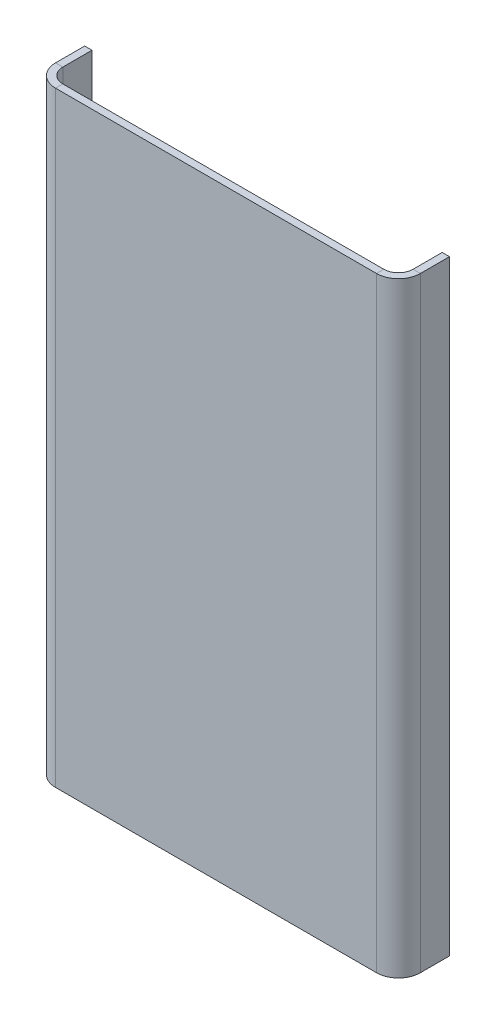
ISO-10303-21;
HEADER;
FILE_DESCRIPTION(('STEP AP214'),'2;1');
FILE_NAME('part.step','',(''),(''),'','','');
FILE_SCHEMA(('AUTOMOTIVE_DESIGN { 1 0 10303 214 1 1 1 1 }'));
ENDSEC;
DATA;
#1=APPLICATION_CONTEXT('core data for automotive mechanical design processes');
#2=APPLICATION_PROTOCOL_DEFINITION('international standard','automotive_design',2000,#1);
#3=PRODUCT_CONTEXT('',#1,'mechanical');
#4=PRODUCT('Part','Part','',(#3));
#5=PRODUCT_RELATED_PRODUCT_CATEGORY('part','',(#4));
#6=PRODUCT_DEFINITION_FORMATION('','',#4);
#7=PRODUCT_DEFINITION_CONTEXT('part definition',#1,'design');
#8=PRODUCT_DEFINITION('design','',#6,#7);
#9=PRODUCT_DEFINITION_SHAPE('','',#8);
#10=(LENGTH_UNIT() NAMED_UNIT(*) SI_UNIT(.MILLI.,.METRE.));
#11=(NAMED_UNIT(*) PLANE_ANGLE_UNIT() SI_UNIT($,.RADIAN.));
#12=(NAMED_UNIT(*) SI_UNIT($,.STERADIAN.) SOLID_ANGLE_UNIT());
#13=UNCERTAINTY_MEASURE_WITH_UNIT(LENGTH_MEASURE(1.E-05),#10,'distance_accuracy_value','');
#14=(GEOMETRIC_REPRESENTATION_CONTEXT(3) GLOBAL_UNCERTAINTY_ASSIGNED_CONTEXT((#13)) GLOBAL_UNIT_ASSIGNED_CONTEXT((#10,
#11,#12)) REPRESENTATION_CONTEXT('',''));
#15=CARTESIAN_POINT('',(0.,0.,0.));
#16=DIRECTION('',(0.,0.,1.));
#17=DIRECTION('',(1.,0.,0.));
#18=AXIS2_PLACEMENT_3D('',#15,#16,#17);
#19=CARTESIAN_POINT('',(0.,0.,-10.));
#20=DIRECTION('',(0.,0.,-1.));
#21=DIRECTION('',(-1.,0.,0.));
#22=AXIS2_PLACEMENT_3D('',#19,#20,#21);
#23=PLANE('',#22);
#24=DIRECTION('',(-1.,0.,0.));
#25=VECTOR('',#24,1.);
#26=CARTESIAN_POINT('',(-250.,415.,-10.));
#27=LINE('',#26,#25);
#28=CARTESIAN_POINT('',(220.,415.,-10.0000000000001));
#29=VERTEX_POINT('',#28);
#30=CARTESIAN_POINT('',(-220.,415.,-10.));
#31=VERTEX_POINT('',#30);
#32=EDGE_CURVE('E93',#29,#31,#27,.T.);
#33=ORIENTED_EDGE('',*,*,#32,.F.);
#34=DIRECTION('',(0.,-1.,0.));
#35=VECTOR('',#34,1.);
#36=CARTESIAN_POINT('',(220.,-415.,-10.0000000000001));
#37=LINE('',#36,#35);
#38=CARTESIAN_POINT('',(220.,-415.,-10.0000000000001));
#39=VERTEX_POINT('',#38);
#40=EDGE_CURVE('E229',#39,#29,#37,.F.);
#41=ORIENTED_EDGE('',*,*,#40,.F.);
#42=DIRECTION('',(1.,0.,0.));
#43=VECTOR('',#42,1.);
#44=CARTESIAN_POINT('',(-250.,-415.,-10.));
#45=LINE('',#44,#43);
#46=CARTESIAN_POINT('',(-220.,-415.,-10.));
#47=VERTEX_POINT('',#46);
#48=EDGE_CURVE('E13',#47,#39,#45,.T.);
#49=ORIENTED_EDGE('',*,*,#48,.F.);
#50=DIRECTION('',(0.,1.,0.));
#51=VECTOR('',#50,1.);
#52=CARTESIAN_POINT('',(-220.,415.,-10.0000000000001));
#53=LINE('',#52,#51);
#54=EDGE_CURVE('E283',#31,#47,#53,.F.);
#55=ORIENTED_EDGE('',*,*,#54,.F.);
#56=EDGE_LOOP('',(#33,#41,#49,#55));
#57=FACE_BOUND('',#56,.T.);
#58=ADVANCED_FACE('F84',(#57),#23,.T.);
#59=CARTESIAN_POINT('',(0.,0.,0.));
#60=DIRECTION('',(0.,0.,-1.));
#61=DIRECTION('',(-1.,0.,0.));
#62=AXIS2_PLACEMENT_3D('',#59,#60,#61);
#63=PLANE('',#62);
#64=DIRECTION('',(0.,-1.,0.));
#65=VECTOR('',#64,1.);
#66=CARTESIAN_POINT('',(220.,-415.,0.));
#67=LINE('',#66,#65);
#68=CARTESIAN_POINT('',(220.,-415.,0.));
#69=VERTEX_POINT('',#68);
#70=CARTESIAN_POINT('',(220.,415.,0.));
#71=VERTEX_POINT('',#70);
#72=EDGE_CURVE('E217',#69,#71,#67,.F.);
#73=ORIENTED_EDGE('',*,*,#72,.T.);
#74=DIRECTION('',(-1.,0.,0.));
#75=VECTOR('',#74,1.);
#76=CARTESIAN_POINT('',(-250.,415.,0.));
#77=LINE('',#76,#75);
#78=CARTESIAN_POINT('',(-220.,415.,0.));
#79=VERTEX_POINT('',#78);
#80=EDGE_CURVE('E289',#71,#79,#77,.T.);
#81=ORIENTED_EDGE('',*,*,#80,.T.);
#82=DIRECTION('',(0.,1.,0.));
#83=VECTOR('',#82,1.);
#84=CARTESIAN_POINT('',(-220.,415.,0.));
#85=LINE('',#84,#83);
#86=CARTESIAN_POINT('',(-220.,-415.,0.));
#87=VERTEX_POINT('',#86);
#88=EDGE_CURVE('E271',#79,#87,#85,.F.);
#89=ORIENTED_EDGE('',*,*,#88,.T.);
#90=DIRECTION('',(1.,0.,0.));
#91=VECTOR('',#90,1.);
#92=CARTESIAN_POINT('',(-250.,-415.,0.));
#93=LINE('',#92,#91);
#94=EDGE_CURVE('E88',#87,#69,#93,.T.);
#95=ORIENTED_EDGE('',*,*,#94,.T.);
#96=EDGE_LOOP('',(#73,#81,#89,#95));
#97=FACE_BOUND('',#96,.T.);
#98=ADVANCED_FACE('F295',(#97),#63,.F.);
#99=CARTESIAN_POINT('',(-250.,-415.,-10.));
#100=DIRECTION('',(0.,-1.,0.));
#101=DIRECTION('',(0.,0.,-1.));
#102=AXIS2_PLACEMENT_3D('',#99,#100,#101);
#103=PLANE('',#102);
#104=ORIENTED_EDGE('',*,*,#48,.T.);
#105=DIRECTION('',(0.,0.,1.));
#106=VECTOR('',#105,1.);
#107=CARTESIAN_POINT('',(220.,-415.,-10.0000000000001));
#108=LINE('',#107,#106);
#109=EDGE_CURVE('E223',#39,#69,#108,.T.);
#110=ORIENTED_EDGE('',*,*,#109,.T.);
#111=ORIENTED_EDGE('',*,*,#94,.F.);
#112=DIRECTION('',(0.,0.,1.));
#113=VECTOR('',#112,1.);
#114=CARTESIAN_POINT('',(-220.,-415.,-10.0000000000001));
#115=LINE('',#114,#113);
#116=EDGE_CURVE('E107',#47,#87,#115,.T.);
#117=ORIENTED_EDGE('',*,*,#116,.F.);
#118=EDGE_LOOP('',(#104,#110,#111,#117));
#119=FACE_BOUND('',#118,.T.);
#120=ADVANCED_FACE('F298',(#119),#103,.T.);
#121=CARTESIAN_POINT('',(-250.,415.,-10.));
#122=DIRECTION('',(0.,1.,0.));
#123=DIRECTION('',(0.,0.,1.));
#124=AXIS2_PLACEMENT_3D('',#121,#122,#123);
#125=PLANE('',#124);
#126=DIRECTION('',(0.,0.,1.));
#127=VECTOR('',#126,1.);
#128=CARTESIAN_POINT('',(220.,415.,-10.0000000000001));
#129=LINE('',#128,#127);
#130=EDGE_CURVE('E235',#29,#71,#129,.T.);
#131=ORIENTED_EDGE('',*,*,#130,.F.);
#132=ORIENTED_EDGE('',*,*,#32,.T.);
#133=DIRECTION('',(0.,0.,1.));
#134=VECTOR('',#133,1.);
#135=CARTESIAN_POINT('',(-220.,415.,-10.0000000000001));
#136=LINE('',#135,#134);
#137=EDGE_CURVE('E277',#31,#79,#136,.T.);
#138=ORIENTED_EDGE('',*,*,#137,.T.);
#139=ORIENTED_EDGE('',*,*,#80,.F.);
#140=EDGE_LOOP('',(#131,#132,#138,#139));
#141=FACE_BOUND('',#140,.T.);
#142=ADVANCED_FACE('F86',(#141),#125,.T.);
#143=CARTESIAN_POINT('',(-220.,-415.,-30.));
#144=DIRECTION('',(0.,-1.,0.));
#145=DIRECTION('',(0.,0.,-1.));
#146=AXIS2_PLACEMENT_3D('',#143,#144,#145);
#147=PLANE('',#146);
#148=DIRECTION('',(1.,0.,0.));
#149=VECTOR('',#148,1.);
#150=CARTESIAN_POINT('',(-250.,-415.,-29.9999999999999));
#151=LINE('',#150,#149);
#152=CARTESIAN_POINT('',(-240.,-415.,-30.));
#153=VERTEX_POINT('',#152);
#154=CARTESIAN_POINT('',(-250.,-415.,-29.9999999999999));
#155=VERTEX_POINT('',#154);
#156=EDGE_CURVE('E238',#153,#155,#151,.F.);
#157=ORIENTED_EDGE('',*,*,#156,.F.);
#158=CARTESIAN_POINT('',(-220.,-415.,-30.));
#159=DIRECTION('',(0.,1.,0.));
#160=DIRECTION('',(0.,0.,1.));
#161=AXIS2_PLACEMENT_3D('',#158,#159,#160);
#162=CIRCLE('',#161,20.);
#163=EDGE_CURVE('E280',#47,#153,#162,.F.);
#164=ORIENTED_EDGE('',*,*,#163,.F.);
#165=ORIENTED_EDGE('',*,*,#116,.T.);
#166=CARTESIAN_POINT('',(-220.,-415.,-30.));
#167=DIRECTION('',(0.,1.,0.));
#168=DIRECTION('',(0.,0.,1.));
#169=AXIS2_PLACEMENT_3D('',#166,#167,#168);
#170=CIRCLE('',#169,30.);
#171=EDGE_CURVE('E273',#87,#155,#170,.F.);
#172=ORIENTED_EDGE('',*,*,#171,.T.);
#173=EDGE_LOOP('',(#157,#164,#165,#172));
#174=FACE_BOUND('',#173,.T.);
#175=ADVANCED_FACE('F350',(#174),#147,.T.);
#176=CARTESIAN_POINT('',(-220.,415.,-30.));
#177=DIRECTION('',(0.,-1.,0.));
#178=DIRECTION('',(0.,0.,-1.));
#179=AXIS2_PLACEMENT_3D('',#176,#177,#178);
#180=PLANE('',#179);
#181=CARTESIAN_POINT('',(-220.,415.,-30.));
#182=DIRECTION('',(0.,1.,0.));
#183=DIRECTION('',(0.,0.,1.));
#184=AXIS2_PLACEMENT_3D('',#181,#182,#183);
#185=CIRCLE('',#184,20.);
#186=CARTESIAN_POINT('',(-240.,415.,-30.));
#187=VERTEX_POINT('',#186);
#188=EDGE_CURVE('E244',#187,#31,#185,.T.);
#189=ORIENTED_EDGE('',*,*,#188,.F.);
#190=DIRECTION('',(1.,0.,0.));
#191=VECTOR('',#190,1.);
#192=CARTESIAN_POINT('',(-240.,415.,-30.));
#193=LINE('',#192,#191);
#194=CARTESIAN_POINT('',(-250.,415.,-29.9999999999999));
#195=VERTEX_POINT('',#194);
#196=EDGE_CURVE('E264',#187,#195,#193,.F.);
#197=ORIENTED_EDGE('',*,*,#196,.T.);
#198=CARTESIAN_POINT('',(-220.,415.,-30.));
#199=DIRECTION('',(0.,1.,0.));
#200=DIRECTION('',(0.,0.,1.));
#201=AXIS2_PLACEMENT_3D('',#198,#199,#200);
#202=CIRCLE('',#201,30.);
#203=EDGE_CURVE('E274',#195,#79,#202,.T.);
#204=ORIENTED_EDGE('',*,*,#203,.T.);
#205=ORIENTED_EDGE('',*,*,#137,.F.);
#206=EDGE_LOOP('',(#189,#197,#204,#205));
#207=FACE_BOUND('',#206,.T.);
#208=ADVANCED_FACE('F323',(#207),#180,.F.);
#209=CARTESIAN_POINT('',(-220.,415.,-30.));
#210=DIRECTION('',(0.,1.,0.));
#211=DIRECTION('',(-1.,0.,0.));
#212=AXIS2_PLACEMENT_3D('',#209,#210,#211);
#213=CYLINDRICAL_SURFACE('',#212,30.);
#214=ORIENTED_EDGE('',*,*,#88,.F.);
#215=ORIENTED_EDGE('',*,*,#203,.F.);
#216=DIRECTION('',(0.,1.,0.));
#217=VECTOR('',#216,1.);
#218=CARTESIAN_POINT('',(-250.,-415.,-29.9999999999999));
#219=LINE('',#218,#217);
#220=EDGE_CURVE('E262',#195,#155,#219,.F.);
#221=ORIENTED_EDGE('',*,*,#220,.T.);
#222=ORIENTED_EDGE('',*,*,#171,.F.);
#223=EDGE_LOOP('',(#214,#215,#221,#222));
#224=FACE_BOUND('',#223,.T.);
#225=ADVANCED_FACE('F348',(#224),#213,.T.);
#226=CARTESIAN_POINT('',(-220.,415.,-30.));
#227=DIRECTION('',(0.,1.,0.));
#228=DIRECTION('',(-1.,0.,0.));
#229=AXIS2_PLACEMENT_3D('',#226,#227,#228);
#230=CYLINDRICAL_SURFACE('',#229,20.);
#231=ORIENTED_EDGE('',*,*,#54,.T.);
#232=ORIENTED_EDGE('',*,*,#163,.T.);
#233=DIRECTION('',(0.,1.,0.));
#234=VECTOR('',#233,1.);
#235=CARTESIAN_POINT('',(-240.,-415.,-30.));
#236=LINE('',#235,#234);
#237=EDGE_CURVE('E267',#153,#187,#236,.T.);
#238=ORIENTED_EDGE('',*,*,#237,.T.);
#239=ORIENTED_EDGE('',*,*,#188,.T.);
#240=EDGE_LOOP('',(#231,#232,#238,#239));
#241=FACE_BOUND('',#240,.T.);
#242=ADVANCED_FACE('F325',(#241),#230,.F.);
#243=CARTESIAN_POINT('',(-250.,415.,-70.));
#244=DIRECTION('',(0.,-1.,0.));
#245=DIRECTION('',(0.,0.,-1.));
#246=AXIS2_PLACEMENT_3D('',#243,#244,#245);
#247=PLANE('',#246);
#248=ORIENTED_EDGE('',*,*,#196,.F.);
#249=DIRECTION('',(0.,0.,1.));
#250=VECTOR('',#249,1.);
#251=CARTESIAN_POINT('',(-240.,415.,-70.));
#252=LINE('',#251,#250);
#253=CARTESIAN_POINT('',(-240.,415.,-70.));
#254=VERTEX_POINT('',#253);
#255=EDGE_CURVE('E260',#187,#254,#252,.F.);
#256=ORIENTED_EDGE('',*,*,#255,.T.);
#257=DIRECTION('',(1.,0.,0.));
#258=VECTOR('',#257,1.);
#259=CARTESIAN_POINT('',(-250.,415.,-70.));
#260=LINE('',#259,#258);
#261=CARTESIAN_POINT('',(-250.,415.,-70.));
#262=VERTEX_POINT('',#261);
#263=EDGE_CURVE('E241',#262,#254,#260,.T.);
#264=ORIENTED_EDGE('',*,*,#263,.F.);
#265=DIRECTION('',(0.,0.,-1.));
#266=VECTOR('',#265,1.);
#267=CARTESIAN_POINT('',(-250.,415.,9.60100667242728E-13));
#268=LINE('',#267,#266);
#269=EDGE_CURVE('E253',#195,#262,#268,.T.);
#270=ORIENTED_EDGE('',*,*,#269,.F.);
#271=EDGE_LOOP('',(#248,#256,#264,#270));
#272=FACE_BOUND('',#271,.T.);
#273=ADVANCED_FACE('F342',(#272),#247,.F.);
#274=CARTESIAN_POINT('',(-250.,-415.,-9.99999999999997));
#275=DIRECTION('',(0.,1.,0.));
#276=DIRECTION('',(0.,0.,1.));
#277=AXIS2_PLACEMENT_3D('',#274,#275,#276);
#278=PLANE('',#277);
#279=ORIENTED_EDGE('',*,*,#156,.T.);
#280=DIRECTION('',(0.,0.,1.));
#281=VECTOR('',#280,1.);
#282=CARTESIAN_POINT('',(-250.,-415.,9.60100667242728E-13));
#283=LINE('',#282,#281);
#284=CARTESIAN_POINT('',(-250.,-415.,-70.));
#285=VERTEX_POINT('',#284);
#286=EDGE_CURVE('E248',#285,#155,#283,.T.);
#287=ORIENTED_EDGE('',*,*,#286,.F.);
#288=DIRECTION('',(1.,0.,0.));
#289=VECTOR('',#288,1.);
#290=CARTESIAN_POINT('',(-250.,-415.,-70.));
#291=LINE('',#290,#289);
#292=CARTESIAN_POINT('',(-240.,-415.,-70.));
#293=VERTEX_POINT('',#292);
#294=EDGE_CURVE('E245',#285,#293,#291,.T.);
#295=ORIENTED_EDGE('',*,*,#294,.T.);
#296=DIRECTION('',(0.,0.,-1.));
#297=VECTOR('',#296,1.);
#298=CARTESIAN_POINT('',(-240.,-415.,-10.));
#299=LINE('',#298,#297);
#300=EDGE_CURVE('E255',#293,#153,#299,.F.);
#301=ORIENTED_EDGE('',*,*,#300,.T.);
#302=EDGE_LOOP('',(#279,#287,#295,#301));
#303=FACE_BOUND('',#302,.T.);
#304=ADVANCED_FACE('F333',(#303),#278,.F.);
#305=CARTESIAN_POINT('',(-250.,0.,9.60100667242728E-13));
#306=DIRECTION('',(1.,0.,0.));
#307=DIRECTION('',(0.,0.,-1.));
#308=AXIS2_PLACEMENT_3D('',#305,#306,#307);
#309=PLANE('',#308);
#310=ORIENTED_EDGE('',*,*,#220,.F.);
#311=ORIENTED_EDGE('',*,*,#269,.T.);
#312=DIRECTION('',(0.,-1.,0.));
#313=VECTOR('',#312,1.);
#314=CARTESIAN_POINT('',(-250.,0.,-70.));
#315=LINE('',#314,#313);
#316=EDGE_CURVE('E251',#262,#285,#315,.T.);
#317=ORIENTED_EDGE('',*,*,#316,.T.);
#318=ORIENTED_EDGE('',*,*,#286,.T.);
#319=EDGE_LOOP('',(#310,#311,#317,#318));
#320=FACE_BOUND('',#319,.T.);
#321=ADVANCED_FACE('F345',(#320),#309,.F.);
#322=CARTESIAN_POINT('',(-240.,0.,9.25185853854296E-13));
#323=DIRECTION('',(1.,0.,0.));
#324=DIRECTION('',(0.,0.,-1.));
#325=AXIS2_PLACEMENT_3D('',#322,#323,#324);
#326=PLANE('',#325);
#327=ORIENTED_EDGE('',*,*,#255,.F.);
#328=ORIENTED_EDGE('',*,*,#237,.F.);
#329=ORIENTED_EDGE('',*,*,#300,.F.);
#330=DIRECTION('',(0.,1.,0.));
#331=VECTOR('',#330,1.);
#332=CARTESIAN_POINT('',(-240.,-415.,-70.));
#333=LINE('',#332,#331);
#334=EDGE_CURVE('E258',#254,#293,#333,.F.);
#335=ORIENTED_EDGE('',*,*,#334,.F.);
#336=EDGE_LOOP('',(#327,#328,#329,#335));
#337=FACE_BOUND('',#336,.T.);
#338=ADVANCED_FACE('F330',(#337),#326,.T.);
#339=CARTESIAN_POINT('',(-250.,-415.,-70.));
#340=DIRECTION('',(0.,0.,1.));
#341=DIRECTION('',(1.,0.,0.));
#342=AXIS2_PLACEMENT_3D('',#339,#340,#341);
#343=PLANE('',#342);
#344=ORIENTED_EDGE('',*,*,#334,.T.);
#345=ORIENTED_EDGE('',*,*,#294,.F.);
#346=ORIENTED_EDGE('',*,*,#316,.F.);
#347=ORIENTED_EDGE('',*,*,#263,.T.);
#348=EDGE_LOOP('',(#344,#345,#346,#347));
#349=FACE_BOUND('',#348,.T.);
#350=ADVANCED_FACE('F338',(#349),#343,.F.);
#351=CARTESIAN_POINT('',(220.,415.,-30.));
#352=DIRECTION('',(0.,1.,0.));
#353=DIRECTION('',(0.,0.,1.));
#354=AXIS2_PLACEMENT_3D('',#351,#352,#353);
#355=PLANE('',#354);
#356=DIRECTION('',(-1.,0.,0.));
#357=VECTOR('',#356,1.);
#358=CARTESIAN_POINT('',(250.,415.,-29.9999999999999));
#359=LINE('',#358,#357);
#360=CARTESIAN_POINT('',(240.,415.,-30.));
#361=VERTEX_POINT('',#360);
#362=CARTESIAN_POINT('',(250.,415.,-29.9999999999999));
#363=VERTEX_POINT('',#362);
#364=EDGE_CURVE('E199',#361,#363,#359,.F.);
#365=ORIENTED_EDGE('',*,*,#364,.F.);
#366=CARTESIAN_POINT('',(220.,415.,-30.));
#367=DIRECTION('',(0.,-1.,0.));
#368=DIRECTION('',(0.,0.,-1.));
#369=AXIS2_PLACEMENT_3D('',#366,#367,#368);
#370=CIRCLE('',#369,20.);
#371=EDGE_CURVE('E226',#29,#361,#370,.F.);
#372=ORIENTED_EDGE('',*,*,#371,.F.);
#373=ORIENTED_EDGE('',*,*,#130,.T.);
#374=CARTESIAN_POINT('',(220.,415.,-30.));
#375=DIRECTION('',(0.,-1.,0.));
#376=DIRECTION('',(0.,0.,-1.));
#377=AXIS2_PLACEMENT_3D('',#374,#375,#376);
#378=CIRCLE('',#377,30.);
#379=EDGE_CURVE('E219',#71,#363,#378,.F.);
#380=ORIENTED_EDGE('',*,*,#379,.T.);
#381=EDGE_LOOP('',(#365,#372,#373,#380));
#382=FACE_BOUND('',#381,.T.);
#383=ADVANCED_FACE('F316',(#382),#355,.T.);
#384=CARTESIAN_POINT('',(220.,-415.,-30.));
#385=DIRECTION('',(0.,1.,0.));
#386=DIRECTION('',(0.,0.,1.));
#387=AXIS2_PLACEMENT_3D('',#384,#385,#386);
#388=PLANE('',#387);
#389=CARTESIAN_POINT('',(220.,-415.,-30.));
#390=DIRECTION('',(0.,-1.,0.));
#391=DIRECTION('',(0.,0.,-1.));
#392=AXIS2_PLACEMENT_3D('',#389,#390,#391);
#393=CIRCLE('',#392,20.);
#394=CARTESIAN_POINT('',(240.,-415.,-30.));
#395=VERTEX_POINT('',#394);
#396=EDGE_CURVE('E232',#395,#39,#393,.T.);
#397=ORIENTED_EDGE('',*,*,#396,.F.);
#398=DIRECTION('',(-1.,0.,0.));
#399=VECTOR('',#398,1.);
#400=CARTESIAN_POINT('',(240.,-415.,-30.));
#401=LINE('',#400,#399);
#402=CARTESIAN_POINT('',(250.,-415.,-29.9999999999999));
#403=VERTEX_POINT('',#402);
#404=EDGE_CURVE('E211',#395,#403,#401,.F.);
#405=ORIENTED_EDGE('',*,*,#404,.T.);
#406=CARTESIAN_POINT('',(220.,-415.,-30.));
#407=DIRECTION('',(0.,-1.,0.));
#408=DIRECTION('',(0.,0.,-1.));
#409=AXIS2_PLACEMENT_3D('',#406,#407,#408);
#410=CIRCLE('',#409,30.);
#411=EDGE_CURVE('E220',#403,#69,#410,.T.);
#412=ORIENTED_EDGE('',*,*,#411,.T.);
#413=ORIENTED_EDGE('',*,*,#109,.F.);
#414=EDGE_LOOP('',(#397,#405,#412,#413));
#415=FACE_BOUND('',#414,.T.);
#416=ADVANCED_FACE('F304',(#415),#388,.F.);
#417=CARTESIAN_POINT('',(220.,-415.,-30.));
#418=DIRECTION('',(0.,-1.,0.));
#419=DIRECTION('',(1.,0.,0.));
#420=AXIS2_PLACEMENT_3D('',#417,#418,#419);
#421=CYLINDRICAL_SURFACE('',#420,30.);
#422=ORIENTED_EDGE('',*,*,#72,.F.);
#423=ORIENTED_EDGE('',*,*,#411,.F.);
#424=DIRECTION('',(0.,-1.,0.));
#425=VECTOR('',#424,1.);
#426=CARTESIAN_POINT('',(250.,415.,-29.9999999999999));
#427=LINE('',#426,#425);
#428=EDGE_CURVE('E209',#403,#363,#427,.F.);
#429=ORIENTED_EDGE('',*,*,#428,.T.);
#430=ORIENTED_EDGE('',*,*,#379,.F.);
#431=EDGE_LOOP('',(#422,#423,#429,#430));
#432=FACE_BOUND('',#431,.T.);
#433=ADVANCED_FACE('F303',(#432),#421,.T.);
#434=CARTESIAN_POINT('',(220.,-415.,-30.));
#435=DIRECTION('',(0.,-1.,0.));
#436=DIRECTION('',(1.,0.,0.));
#437=AXIS2_PLACEMENT_3D('',#434,#435,#436);
#438=CYLINDRICAL_SURFACE('',#437,20.);
#439=ORIENTED_EDGE('',*,*,#40,.T.);
#440=ORIENTED_EDGE('',*,*,#371,.T.);
#441=DIRECTION('',(0.,-1.,0.));
#442=VECTOR('',#441,1.);
#443=CARTESIAN_POINT('',(240.,415.,-30.));
#444=LINE('',#443,#442);
#445=EDGE_CURVE('E214',#361,#395,#444,.T.);
#446=ORIENTED_EDGE('',*,*,#445,.T.);
#447=ORIENTED_EDGE('',*,*,#396,.T.);
#448=EDGE_LOOP('',(#439,#440,#446,#447));
#449=FACE_BOUND('',#448,.T.);
#450=ADVANCED_FACE('F313',(#449),#438,.F.);
#451=CARTESIAN_POINT('',(250.,-415.,-70.));
#452=DIRECTION('',(0.,1.,0.));
#453=DIRECTION('',(0.,0.,1.));
#454=AXIS2_PLACEMENT_3D('',#451,#452,#453);
#455=PLANE('',#454);
#456=ORIENTED_EDGE('',*,*,#404,.F.);
#457=DIRECTION('',(0.,0.,1.));
#458=VECTOR('',#457,1.);
#459=CARTESIAN_POINT('',(240.,-415.,-70.));
#460=LINE('',#459,#458);
#461=CARTESIAN_POINT('',(240.,-415.,-70.));
#462=VERTEX_POINT('',#461);
#463=EDGE_CURVE('E207',#395,#462,#460,.F.);
#464=ORIENTED_EDGE('',*,*,#463,.T.);
#465=DIRECTION('',(-1.,0.,0.));
#466=VECTOR('',#465,1.);
#467=CARTESIAN_POINT('',(250.,-415.,-70.));
#468=LINE('',#467,#466);
#469=CARTESIAN_POINT('',(250.,-415.,-70.));
#470=VERTEX_POINT('',#469);
#471=EDGE_CURVE('E195',#470,#462,#468,.T.);
#472=ORIENTED_EDGE('',*,*,#471,.F.);
#473=DIRECTION('',(0.,0.,-1.));
#474=VECTOR('',#473,1.);
#475=CARTESIAN_POINT('',(250.,-415.,9.60100667242728E-13));
#476=LINE('',#475,#474);
#477=EDGE_CURVE('E182',#403,#470,#476,.T.);
#478=ORIENTED_EDGE('',*,*,#477,.F.);
#479=EDGE_LOOP('',(#456,#464,#472,#478));
#480=FACE_BOUND('',#479,.T.);
#481=ADVANCED_FACE('F308',(#480),#455,.F.);
#482=CARTESIAN_POINT('',(250.,415.,-9.99999999999997));
#483=DIRECTION('',(0.,-1.,0.));
#484=DIRECTION('',(0.,0.,-1.));
#485=AXIS2_PLACEMENT_3D('',#482,#483,#484);
#486=PLANE('',#485);
#487=ORIENTED_EDGE('',*,*,#364,.T.);
#488=DIRECTION('',(0.,0.,1.));
#489=VECTOR('',#488,1.);
#490=CARTESIAN_POINT('',(250.,415.,9.60100667242728E-13));
#491=LINE('',#490,#489);
#492=CARTESIAN_POINT('',(250.,415.,-70.));
#493=VERTEX_POINT('',#492);
#494=EDGE_CURVE('E180',#493,#363,#491,.T.);
#495=ORIENTED_EDGE('',*,*,#494,.F.);
#496=DIRECTION('',(-1.,0.,0.));
#497=VECTOR('',#496,1.);
#498=CARTESIAN_POINT('',(250.,415.,-70.));
#499=LINE('',#498,#497);
#500=CARTESIAN_POINT('',(240.,415.,-70.));
#501=VERTEX_POINT('',#500);
#502=EDGE_CURVE('E188',#493,#501,#499,.T.);
#503=ORIENTED_EDGE('',*,*,#502,.T.);
#504=DIRECTION('',(0.,0.,-1.));
#505=VECTOR('',#504,1.);
#506=CARTESIAN_POINT('',(240.,415.,-10.));
#507=LINE('',#506,#505);
#508=EDGE_CURVE('E204',#501,#361,#507,.F.);
#509=ORIENTED_EDGE('',*,*,#508,.T.);
#510=EDGE_LOOP('',(#487,#495,#503,#509));
#511=FACE_BOUND('',#510,.T.);
#512=ADVANCED_FACE('F198',(#511),#486,.F.);
#513=CARTESIAN_POINT('',(250.,0.,9.60100667242728E-13));
#514=DIRECTION('',(-1.,0.,0.));
#515=DIRECTION('',(0.,0.,1.));
#516=AXIS2_PLACEMENT_3D('',#513,#514,#515);
#517=PLANE('',#516);
#518=ORIENTED_EDGE('',*,*,#428,.F.);
#519=ORIENTED_EDGE('',*,*,#477,.T.);
#520=DIRECTION('',(0.,1.,0.));
#521=VECTOR('',#520,1.);
#522=CARTESIAN_POINT('',(250.,0.,-70.));
#523=LINE('',#522,#521);
#524=EDGE_CURVE('E175',#470,#493,#523,.T.);
#525=ORIENTED_EDGE('',*,*,#524,.T.);
#526=ORIENTED_EDGE('',*,*,#494,.T.);
#527=EDGE_LOOP('',(#518,#519,#525,#526));
#528=FACE_BOUND('',#527,.T.);
#529=ADVANCED_FACE('F178',(#528),#517,.F.);
#530=CARTESIAN_POINT('',(240.,0.,9.25185853854296E-13));
#531=DIRECTION('',(-1.,0.,0.));
#532=DIRECTION('',(0.,0.,1.));
#533=AXIS2_PLACEMENT_3D('',#530,#531,#532);
#534=PLANE('',#533);
#535=ORIENTED_EDGE('',*,*,#463,.F.);
#536=ORIENTED_EDGE('',*,*,#445,.F.);
#537=ORIENTED_EDGE('',*,*,#508,.F.);
#538=DIRECTION('',(0.,-1.,0.));
#539=VECTOR('',#538,1.);
#540=CARTESIAN_POINT('',(240.,415.,-70.));
#541=LINE('',#540,#539);
#542=EDGE_CURVE('E191',#462,#501,#541,.F.);
#543=ORIENTED_EDGE('',*,*,#542,.F.);
#544=EDGE_LOOP('',(#535,#536,#537,#543));
#545=FACE_BOUND('',#544,.T.);
#546=ADVANCED_FACE('F311',(#545),#534,.T.);
#547=CARTESIAN_POINT('',(250.,415.,-70.));
#548=DIRECTION('',(0.,0.,1.));
#549=DIRECTION('',(1.,0.,0.));
#550=AXIS2_PLACEMENT_3D('',#547,#548,#549);
#551=PLANE('',#550);
#552=ORIENTED_EDGE('',*,*,#542,.T.);
#553=ORIENTED_EDGE('',*,*,#502,.F.);
#554=ORIENTED_EDGE('',*,*,#524,.F.);
#555=ORIENTED_EDGE('',*,*,#471,.T.);
#556=EDGE_LOOP('',(#552,#553,#554,#555));
#557=FACE_BOUND('',#556,.T.);
#558=ADVANCED_FACE('F189',(#557),#551,.F.);
#559=CLOSED_SHELL('',(#58,#98,#120,#142,#175,#208,#225,#242,#273,#304,#321,#338,#350,#383,#416,
#433,#450,#481,#512,#529,#546,#558));
#560=MANIFOLD_SOLID_BREP('B2',#559);
#561=ADVANCED_BREP_SHAPE_REPRESENTATION('',(#18,#560),#14);
#562=SHAPE_DEFINITION_REPRESENTATION(#9,#561);
ENDSEC;
END-ISO-10303-21;
